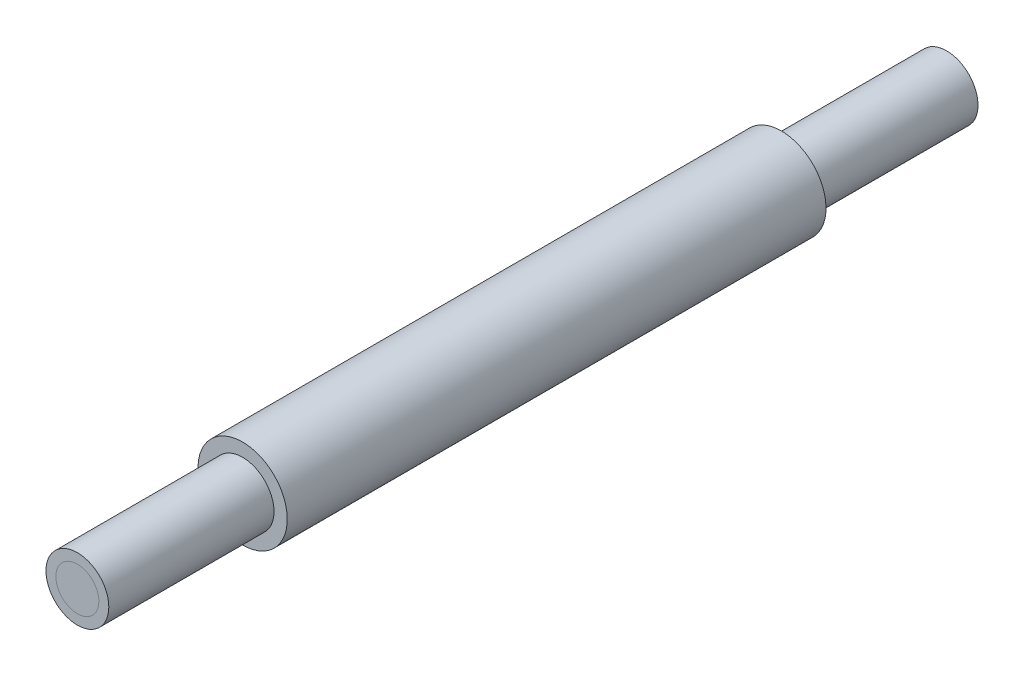
ISO-10303-21;
HEADER;
FILE_DESCRIPTION(('STEP AP214'),'2;1');
FILE_NAME('part.step','',(''),(''),'','','');
FILE_SCHEMA(('AUTOMOTIVE_DESIGN { 1 0 10303 214 1 1 1 1 }'));
ENDSEC;
DATA;
#1=APPLICATION_CONTEXT('core data for automotive mechanical design processes');
#2=APPLICATION_PROTOCOL_DEFINITION('international standard','automotive_design',2000,#1);
#3=PRODUCT_CONTEXT('',#1,'mechanical');
#4=PRODUCT('Part','Part','',(#3));
#5=PRODUCT_RELATED_PRODUCT_CATEGORY('part','',(#4));
#6=PRODUCT_DEFINITION_FORMATION('','',#4);
#7=PRODUCT_DEFINITION_CONTEXT('part definition',#1,'design');
#8=PRODUCT_DEFINITION('design','',#6,#7);
#9=PRODUCT_DEFINITION_SHAPE('','',#8);
#10=(LENGTH_UNIT() NAMED_UNIT(*) SI_UNIT(.MILLI.,.METRE.));
#11=(NAMED_UNIT(*) PLANE_ANGLE_UNIT() SI_UNIT($,.RADIAN.));
#12=(NAMED_UNIT(*) SI_UNIT($,.STERADIAN.) SOLID_ANGLE_UNIT());
#13=UNCERTAINTY_MEASURE_WITH_UNIT(LENGTH_MEASURE(1.E-05),#10,'distance_accuracy_value','');
#14=(GEOMETRIC_REPRESENTATION_CONTEXT(3) GLOBAL_UNCERTAINTY_ASSIGNED_CONTEXT((#13)) GLOBAL_UNIT_ASSIGNED_CONTEXT((#10,
#11,#12)) REPRESENTATION_CONTEXT('',''));
#15=CARTESIAN_POINT('',(0.,0.,0.));
#16=DIRECTION('',(0.,0.,1.));
#17=DIRECTION('',(1.,0.,0.));
#18=AXIS2_PLACEMENT_3D('',#15,#16,#17);
#19=CARTESIAN_POINT('',(0.,0.095,0.815));
#20=DIRECTION('',(0.,0.,-1.));
#21=DIRECTION('',(0.,1.,0.));
#22=AXIS2_PLACEMENT_3D('',#19,#20,#21);
#23=PLANE('',#22);
#24=CARTESIAN_POINT('',(0.,0.,0.815));
#25=DIRECTION('',(0.,0.,1.));
#26=DIRECTION('',(0.,-1.,0.));
#27=AXIS2_PLACEMENT_3D('',#24,#25,#26);
#28=CIRCLE('',#27,0.0949999999999999);
#29=CARTESIAN_POINT('',(0.,-0.0949999999999998,0.815));
#30=VERTEX_POINT('',#29);
#31=EDGE_CURVE('E67',#30,#30,#28,.T.);
#32=ORIENTED_EDGE('',*,*,#31,.F.);
#33=EDGE_LOOP('',(#32));
#34=FACE_BOUND('',#33,.T.);
#35=CARTESIAN_POINT('',(0.,0.,0.815));
#36=DIRECTION('',(0.,0.,1.));
#37=DIRECTION('',(0.,-1.,0.));
#38=AXIS2_PLACEMENT_3D('',#35,#36,#37);
#39=CIRCLE('',#38,0.135);
#40=CARTESIAN_POINT('',(0.,-0.135,0.815));
#41=VERTEX_POINT('',#40);
#42=EDGE_CURVE('E58',#41,#41,#39,.T.);
#43=ORIENTED_EDGE('',*,*,#42,.T.);
#44=EDGE_LOOP('',(#43));
#45=FACE_BOUND('',#44,.T.);
#46=ADVANCED_FACE('F37',(#34,#45),#23,.F.);
#47=CARTESIAN_POINT('',(0.,0.,1.315));
#48=DIRECTION('',(0.,0.,1.));
#49=DIRECTION('',(0.,-1.,0.));
#50=AXIS2_PLACEMENT_3D('',#47,#48,#49);
#51=CYLINDRICAL_SURFACE('',#50,0.135);
#52=ORIENTED_EDGE('',*,*,#42,.F.);
#53=EDGE_LOOP('',(#52));
#54=FACE_BOUND('',#53,.T.);
#55=CARTESIAN_POINT('',(0.,0.,-0.815));
#56=DIRECTION('',(0.,0.,1.));
#57=DIRECTION('',(0.,-1.,0.));
#58=AXIS2_PLACEMENT_3D('',#55,#56,#57);
#59=CIRCLE('',#58,0.135);
#60=CARTESIAN_POINT('',(0.,-0.135,-0.815));
#61=VERTEX_POINT('',#60);
#62=EDGE_CURVE('E61',#61,#61,#59,.T.);
#63=ORIENTED_EDGE('',*,*,#62,.T.);
#64=EDGE_LOOP('',(#63));
#65=FACE_BOUND('',#64,.T.);
#66=ADVANCED_FACE('F75',(#54,#65),#51,.T.);
#67=CARTESIAN_POINT('',(0.,0.0950000000000002,-0.815));
#68=DIRECTION('',(0.,0.,1.));
#69=DIRECTION('',(0.,-1.,0.));
#70=AXIS2_PLACEMENT_3D('',#67,#68,#69);
#71=PLANE('',#70);
#72=ORIENTED_EDGE('',*,*,#62,.F.);
#73=EDGE_LOOP('',(#72));
#74=FACE_BOUND('',#73,.T.);
#75=CARTESIAN_POINT('',(0.,0.,-0.815));
#76=DIRECTION('',(0.,0.,1.));
#77=DIRECTION('',(0.,-1.,0.));
#78=AXIS2_PLACEMENT_3D('',#75,#76,#77);
#79=CIRCLE('',#78,0.0949999999999999);
#80=CARTESIAN_POINT('',(0.,-0.0949999999999995,-0.815));
#81=VERTEX_POINT('',#80);
#82=EDGE_CURVE('E64',#81,#81,#79,.T.);
#83=ORIENTED_EDGE('',*,*,#82,.T.);
#84=EDGE_LOOP('',(#83));
#85=FACE_BOUND('',#84,.T.);
#86=ADVANCED_FACE('F81',(#74,#85),#71,.F.);
#87=CARTESIAN_POINT('',(0.,0.,1.315));
#88=DIRECTION('',(0.,0.,1.));
#89=DIRECTION('',(0.,-1.,0.));
#90=AXIS2_PLACEMENT_3D('',#87,#88,#89);
#91=CYLINDRICAL_SURFACE('',#90,0.0949999999999998);
#92=CARTESIAN_POINT('',(0.,0.,-1.31486909947538));
#93=DIRECTION('',(0.,0.,1.));
#94=DIRECTION('',(0.,-1.,0.));
#95=AXIS2_PLACEMENT_3D('',#92,#93,#94);
#96=CIRCLE('',#95,0.0949999999999998);
#97=CARTESIAN_POINT('',(0.,-0.0949999999999994,-1.31486909947538));
#98=VERTEX_POINT('',#97);
#99=EDGE_CURVE('E45',#98,#98,#96,.T.);
#100=ORIENTED_EDGE('',*,*,#99,.T.);
#101=EDGE_LOOP('',(#100));
#102=FACE_BOUND('',#101,.T.);
#103=ORIENTED_EDGE('',*,*,#82,.F.);
#104=EDGE_LOOP('',(#103));
#105=FACE_BOUND('',#104,.T.);
#106=ADVANCED_FACE('F87',(#102,#105),#91,.T.);
#107=CARTESIAN_POINT('',(0.,0.,-1.315));
#108=DIRECTION('',(0.,0.,1.));
#109=DIRECTION('',(0.,-1.,0.));
#110=AXIS2_PLACEMENT_3D('',#107,#108,#109);
#111=PLANE('',#110);
#112=CARTESIAN_POINT('',(0.,0.,-1.315));
#113=DIRECTION('',(0.,0.,1.));
#114=DIRECTION('',(0.,-1.,0.));
#115=AXIS2_PLACEMENT_3D('',#112,#113,#114);
#116=CIRCLE('',#115,0.0649999999999249);
#117=CARTESIAN_POINT('',(0.,-0.0649999999999245,-1.315));
#118=VERTEX_POINT('',#117);
#119=EDGE_CURVE('E10',#118,#118,#116,.F.);
#120=ORIENTED_EDGE('',*,*,#119,.T.);
#121=EDGE_LOOP('',(#120));
#122=FACE_BOUND('',#121,.T.);
#123=ADVANCED_FACE('F92',(#122),#111,.F.);
#124=CARTESIAN_POINT('',(0.,0.,1.315));
#125=DIRECTION('',(0.,0.,-1.));
#126=DIRECTION('',(0.,1.,0.));
#127=AXIS2_PLACEMENT_3D('',#124,#125,#126);
#128=PLANE('',#127);
#129=CARTESIAN_POINT('',(0.,0.,1.315));
#130=DIRECTION('',(0.,0.,-1.));
#131=DIRECTION('',(0.,1.,0.));
#132=AXIS2_PLACEMENT_3D('',#129,#130,#131);
#133=CIRCLE('',#132,0.0649999999999245);
#134=CARTESIAN_POINT('',(0.,0.0649999999999245,1.315));
#135=VERTEX_POINT('',#134);
#136=EDGE_CURVE('E53',#135,#135,#133,.F.);
#137=ORIENTED_EDGE('',*,*,#136,.T.);
#138=EDGE_LOOP('',(#137));
#139=FACE_BOUND('',#138,.T.);
#140=ADVANCED_FACE('F97',(#139),#128,.F.);
#141=CARTESIAN_POINT('',(0.,0.,1.315));
#142=DIRECTION('',(0.,0.,1.));
#143=DIRECTION('',(0.,-1.,0.));
#144=AXIS2_PLACEMENT_3D('',#141,#142,#143);
#145=CYLINDRICAL_SURFACE('',#144,0.0949999999999999);
#146=CARTESIAN_POINT('',(0.,0.,1.31486909947538));
#147=DIRECTION('',(0.,0.,-1.));
#148=DIRECTION('',(0.,1.,0.));
#149=AXIS2_PLACEMENT_3D('',#146,#147,#148);
#150=CIRCLE('',#149,0.0949999999999999);
#151=CARTESIAN_POINT('',(0.,0.0949999999999999,1.31486909947538));
#152=VERTEX_POINT('',#151);
#153=EDGE_CURVE('E49',#152,#152,#150,.T.);
#154=ORIENTED_EDGE('',*,*,#153,.T.);
#155=EDGE_LOOP('',(#154));
#156=FACE_BOUND('',#155,.T.);
#157=ORIENTED_EDGE('',*,*,#31,.T.);
#158=EDGE_LOOP('',(#157));
#159=FACE_BOUND('',#158,.T.);
#160=ADVANCED_FACE('F71',(#156,#159),#145,.T.);
#161=CARTESIAN_POINT('',(0.,0.,1.315));
#162=DIRECTION('',(0.,0.,-1.));
#163=DIRECTION('',(0.,1.,0.));
#164=AXIS2_PLACEMENT_3D('',#161,#162,#163);
#165=CONICAL_SURFACE('',#164,0.0649999999999245,1.56643300366491);
#166=ORIENTED_EDGE('',*,*,#153,.F.);
#167=EDGE_LOOP('',(#166));
#168=FACE_BOUND('',#167,.T.);
#169=ORIENTED_EDGE('',*,*,#136,.F.);
#170=EDGE_LOOP('',(#169));
#171=FACE_BOUND('',#170,.T.);
#172=ADVANCED_FACE('F101',(#168,#171),#165,.T.);
#173=CARTESIAN_POINT('',(0.,0.,-1.31486909947538));
#174=DIRECTION('',(0.,0.,1.));
#175=DIRECTION('',(0.,-1.,0.));
#176=AXIS2_PLACEMENT_3D('',#173,#174,#175);
#177=CONICAL_SURFACE('',#176,0.0949999999999998,1.56643300366491);
#178=ORIENTED_EDGE('',*,*,#119,.F.);
#179=EDGE_LOOP('',(#178));
#180=FACE_BOUND('',#179,.T.);
#181=ORIENTED_EDGE('',*,*,#99,.F.);
#182=EDGE_LOOP('',(#181));
#183=FACE_BOUND('',#182,.T.);
#184=ADVANCED_FACE('F40',(#180,#183),#177,.T.);
#185=CLOSED_SHELL('',(#46,#66,#86,#106,#123,#140,#160,#172,#184));
#186=MANIFOLD_SOLID_BREP('B2',#185);
#187=ADVANCED_BREP_SHAPE_REPRESENTATION('',(#18,#186),#14);
#188=SHAPE_DEFINITION_REPRESENTATION(#9,#187);
ENDSEC;
END-ISO-10303-21;
